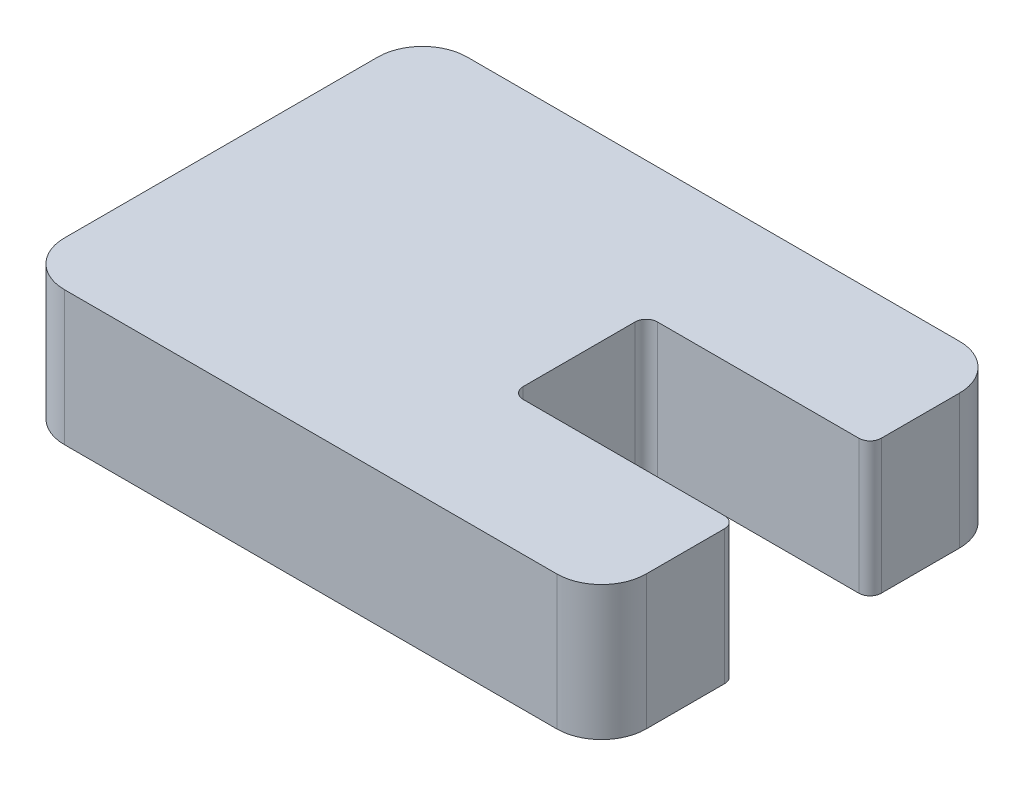
ISO-10303-21;
HEADER;
FILE_DESCRIPTION(('STEP AP214'),'2;1');
FILE_NAME('part.step','',(''),(''),'','','');
FILE_SCHEMA(('AUTOMOTIVE_DESIGN { 1 0 10303 214 1 1 1 1 }'));
ENDSEC;
DATA;
#1=APPLICATION_CONTEXT('core data for automotive mechanical design processes');
#2=APPLICATION_PROTOCOL_DEFINITION('international standard','automotive_design',2000,#1);
#3=PRODUCT_CONTEXT('',#1,'mechanical');
#4=PRODUCT('Part','Part','',(#3));
#5=PRODUCT_RELATED_PRODUCT_CATEGORY('part','',(#4));
#6=PRODUCT_DEFINITION_FORMATION('','',#4);
#7=PRODUCT_DEFINITION_CONTEXT('part definition',#1,'design');
#8=PRODUCT_DEFINITION('design','',#6,#7);
#9=PRODUCT_DEFINITION_SHAPE('','',#8);
#10=(LENGTH_UNIT() NAMED_UNIT(*) SI_UNIT(.MILLI.,.METRE.));
#11=(NAMED_UNIT(*) PLANE_ANGLE_UNIT() SI_UNIT($,.RADIAN.));
#12=(NAMED_UNIT(*) SI_UNIT($,.STERADIAN.) SOLID_ANGLE_UNIT());
#13=UNCERTAINTY_MEASURE_WITH_UNIT(LENGTH_MEASURE(1.E-05),#10,'distance_accuracy_value','');
#14=(GEOMETRIC_REPRESENTATION_CONTEXT(3) GLOBAL_UNCERTAINTY_ASSIGNED_CONTEXT((#13)) GLOBAL_UNIT_ASSIGNED_CONTEXT((#10,
#11,#12)) REPRESENTATION_CONTEXT('',''));
#15=CARTESIAN_POINT('',(0.,0.,0.));
#16=DIRECTION('',(0.,0.,1.));
#17=DIRECTION('',(1.,0.,0.));
#18=AXIS2_PLACEMENT_3D('',#15,#16,#17);
#19=CARTESIAN_POINT('',(12.,3.,3.5));
#20=DIRECTION('',(0.,-1.,0.));
#21=DIRECTION('',(0.,0.,-1.));
#22=AXIS2_PLACEMENT_3D('',#19,#20,#21);
#23=CYLINDRICAL_SURFACE('',#22,1.);
#24=CARTESIAN_POINT('',(12.,0.,3.5));
#25=DIRECTION('',(0.,1.,0.));
#26=DIRECTION('',(0.,0.,1.));
#27=AXIS2_PLACEMENT_3D('',#24,#25,#26);
#28=CIRCLE('',#27,1.);
#29=CARTESIAN_POINT('',(12.,0.,4.5));
#30=VERTEX_POINT('',#29);
#31=CARTESIAN_POINT('',(13.,0.,3.5));
#32=VERTEX_POINT('',#31);
#33=EDGE_CURVE('E170',#30,#32,#28,.T.);
#34=ORIENTED_EDGE('',*,*,#33,.T.);
#35=DIRECTION('',(0.,-1.,0.));
#36=VECTOR('',#35,1.);
#37=CARTESIAN_POINT('',(13.,3.,3.5));
#38=LINE('',#37,#36);
#39=CARTESIAN_POINT('',(13.,3.,3.5));
#40=VERTEX_POINT('',#39);
#41=EDGE_CURVE('E152',#40,#32,#38,.T.);
#42=ORIENTED_EDGE('',*,*,#41,.F.);
#43=CARTESIAN_POINT('',(12.,3.,3.5));
#44=DIRECTION('',(0.,1.,0.));
#45=DIRECTION('',(0.,0.,1.));
#46=AXIS2_PLACEMENT_3D('',#43,#44,#45);
#47=CIRCLE('',#46,1.);
#48=CARTESIAN_POINT('',(12.,3.,4.5));
#49=VERTEX_POINT('',#48);
#50=EDGE_CURVE('E158',#49,#40,#47,.T.);
#51=ORIENTED_EDGE('',*,*,#50,.F.);
#52=DIRECTION('',(0.,-1.,0.));
#53=VECTOR('',#52,1.);
#54=CARTESIAN_POINT('',(12.,3.,4.5));
#55=LINE('',#54,#53);
#56=EDGE_CURVE('E245',#49,#30,#55,.T.);
#57=ORIENTED_EDGE('',*,*,#56,.T.);
#58=EDGE_LOOP('',(#34,#42,#51,#57));
#59=FACE_BOUND('',#58,.T.);
#60=ADVANCED_FACE('F33',(#59),#23,.T.);
#61=CARTESIAN_POINT('',(13.,3.,3.5));
#62=DIRECTION('',(-1.,0.,0.));
#63=DIRECTION('',(0.,0.,1.));
#64=AXIS2_PLACEMENT_3D('',#61,#62,#63);
#65=PLANE('',#64);
#66=DIRECTION('',(0.,0.,-1.));
#67=VECTOR('',#66,1.);
#68=CARTESIAN_POINT('',(13.,0.,3.5));
#69=LINE('',#68,#67);
#70=CARTESIAN_POINT('',(13.,0.,1.75));
#71=VERTEX_POINT('',#70);
#72=EDGE_CURVE('E247',#32,#71,#69,.T.);
#73=ORIENTED_EDGE('',*,*,#72,.T.);
#74=DIRECTION('',(0.,-1.,0.));
#75=VECTOR('',#74,1.);
#76=CARTESIAN_POINT('',(13.,3.,1.75));
#77=LINE('',#76,#75);
#78=CARTESIAN_POINT('',(13.,3.,1.75));
#79=VERTEX_POINT('',#78);
#80=EDGE_CURVE('E155',#71,#79,#77,.F.);
#81=ORIENTED_EDGE('',*,*,#80,.T.);
#82=DIRECTION('',(0.,0.,-1.));
#83=VECTOR('',#82,1.);
#84=CARTESIAN_POINT('',(13.,3.,3.5));
#85=LINE('',#84,#83);
#86=EDGE_CURVE('E147',#40,#79,#85,.T.);
#87=ORIENTED_EDGE('',*,*,#86,.F.);
#88=ORIENTED_EDGE('',*,*,#41,.T.);
#89=EDGE_LOOP('',(#73,#81,#87,#88));
#90=FACE_BOUND('',#89,.T.);
#91=ADVANCED_FACE('F150',(#90),#65,.F.);
#92=CARTESIAN_POINT('',(13.,3.,1.5));
#93=DIRECTION('',(0.,0.,1.));
#94=DIRECTION('',(1.,0.,0.));
#95=AXIS2_PLACEMENT_3D('',#92,#93,#94);
#96=PLANE('',#95);
#97=DIRECTION('',(-1.,0.,0.));
#98=VECTOR('',#97,1.);
#99=CARTESIAN_POINT('',(13.,3.,1.5));
#100=LINE('',#99,#98);
#101=CARTESIAN_POINT('',(12.75,3.,1.5));
#102=VERTEX_POINT('',#101);
#103=CARTESIAN_POINT('',(8.24999999999999,3.,1.5));
#104=VERTEX_POINT('',#103);
#105=EDGE_CURVE('E157',#102,#104,#100,.T.);
#106=ORIENTED_EDGE('',*,*,#105,.F.);
#107=DIRECTION('',(0.,-1.,0.));
#108=VECTOR('',#107,1.);
#109=CARTESIAN_POINT('',(12.75,3.,1.5));
#110=LINE('',#109,#108);
#111=CARTESIAN_POINT('',(12.75,0.,1.5));
#112=VERTEX_POINT('',#111);
#113=EDGE_CURVE('E174',#102,#112,#110,.T.);
#114=ORIENTED_EDGE('',*,*,#113,.T.);
#115=DIRECTION('',(-1.,0.,0.));
#116=VECTOR('',#115,1.);
#117=CARTESIAN_POINT('',(13.,0.,1.5));
#118=LINE('',#117,#116);
#119=CARTESIAN_POINT('',(8.24999999999999,0.,1.5));
#120=VERTEX_POINT('',#119);
#121=EDGE_CURVE('E222',#112,#120,#118,.T.);
#122=ORIENTED_EDGE('',*,*,#121,.T.);
#123=DIRECTION('',(0.,-1.,0.));
#124=VECTOR('',#123,1.);
#125=CARTESIAN_POINT('',(8.24999999999999,3.,1.5));
#126=LINE('',#125,#124);
#127=EDGE_CURVE('E171',#120,#104,#126,.F.);
#128=ORIENTED_EDGE('',*,*,#127,.T.);
#129=EDGE_LOOP('',(#106,#114,#122,#128));
#130=FACE_BOUND('',#129,.T.);
#131=ADVANCED_FACE('F324',(#130),#96,.F.);
#132=CARTESIAN_POINT('',(7.99999999999999,3.,1.5));
#133=DIRECTION('',(-1.,0.,0.));
#134=DIRECTION('',(0.,0.,1.));
#135=AXIS2_PLACEMENT_3D('',#132,#133,#134);
#136=PLANE('',#135);
#137=DIRECTION('',(0.,0.,-1.));
#138=VECTOR('',#137,1.);
#139=CARTESIAN_POINT('',(7.99999999999999,3.,1.5));
#140=LINE('',#139,#138);
#141=CARTESIAN_POINT('',(7.99999999999999,3.,1.25));
#142=VERTEX_POINT('',#141);
#143=CARTESIAN_POINT('',(7.99999999999999,3.,-1.25));
#144=VERTEX_POINT('',#143);
#145=EDGE_CURVE('E226',#142,#144,#140,.T.);
#146=ORIENTED_EDGE('',*,*,#145,.F.);
#147=DIRECTION('',(0.,-1.,0.));
#148=VECTOR('',#147,1.);
#149=CARTESIAN_POINT('',(7.99999999999999,0.,1.25));
#150=LINE('',#149,#148);
#151=CARTESIAN_POINT('',(7.99999999999999,0.,1.25));
#152=VERTEX_POINT('',#151);
#153=EDGE_CURVE('E200',#142,#152,#150,.T.);
#154=ORIENTED_EDGE('',*,*,#153,.T.);
#155=DIRECTION('',(0.,0.,-1.));
#156=VECTOR('',#155,1.);
#157=CARTESIAN_POINT('',(7.99999999999999,0.,1.5));
#158=LINE('',#157,#156);
#159=CARTESIAN_POINT('',(7.99999999999999,0.,-1.25));
#160=VERTEX_POINT('',#159);
#161=EDGE_CURVE('E212',#152,#160,#158,.T.);
#162=ORIENTED_EDGE('',*,*,#161,.T.);
#163=DIRECTION('',(0.,-1.,0.));
#164=VECTOR('',#163,1.);
#165=CARTESIAN_POINT('',(7.99999999999999,3.,-1.25));
#166=LINE('',#165,#164);
#167=EDGE_CURVE('E198',#160,#144,#166,.F.);
#168=ORIENTED_EDGE('',*,*,#167,.T.);
#169=EDGE_LOOP('',(#146,#154,#162,#168));
#170=FACE_BOUND('',#169,.T.);
#171=ADVANCED_FACE('F219',(#170),#136,.F.);
#172=CARTESIAN_POINT('',(7.99999999999999,3.,-1.5));
#173=DIRECTION('',(0.,0.,-1.));
#174=DIRECTION('',(-1.,0.,0.));
#175=AXIS2_PLACEMENT_3D('',#172,#173,#174);
#176=PLANE('',#175);
#177=DIRECTION('',(1.,0.,0.));
#178=VECTOR('',#177,1.);
#179=CARTESIAN_POINT('',(7.99999999999999,0.,-1.5));
#180=LINE('',#179,#178);
#181=CARTESIAN_POINT('',(8.24999999999999,0.,-1.5));
#182=VERTEX_POINT('',#181);
#183=CARTESIAN_POINT('',(12.75,0.,-1.5));
#184=VERTEX_POINT('',#183);
#185=EDGE_CURVE('E213',#182,#184,#180,.T.);
#186=ORIENTED_EDGE('',*,*,#185,.T.);
#187=DIRECTION('',(0.,-1.,0.));
#188=VECTOR('',#187,1.);
#189=CARTESIAN_POINT('',(12.75,3.,-1.5));
#190=LINE('',#189,#188);
#191=CARTESIAN_POINT('',(12.75,3.,-1.5));
#192=VERTEX_POINT('',#191);
#193=EDGE_CURVE('E56',#184,#192,#190,.F.);
#194=ORIENTED_EDGE('',*,*,#193,.T.);
#195=DIRECTION('',(1.,0.,0.));
#196=VECTOR('',#195,1.);
#197=CARTESIAN_POINT('',(7.99999999999999,3.,-1.5));
#198=LINE('',#197,#196);
#199=CARTESIAN_POINT('',(8.24999999999999,3.,-1.5));
#200=VERTEX_POINT('',#199);
#201=EDGE_CURVE('E225',#200,#192,#198,.T.);
#202=ORIENTED_EDGE('',*,*,#201,.F.);
#203=DIRECTION('',(0.,-1.,0.));
#204=VECTOR('',#203,1.);
#205=CARTESIAN_POINT('',(8.24999999999999,0.,-1.5));
#206=LINE('',#205,#204);
#207=EDGE_CURVE('E194',#200,#182,#206,.T.);
#208=ORIENTED_EDGE('',*,*,#207,.T.);
#209=EDGE_LOOP('',(#186,#194,#202,#208));
#210=FACE_BOUND('',#209,.T.);
#211=ADVANCED_FACE('F227',(#210),#176,.F.);
#212=CARTESIAN_POINT('',(13.,3.,-1.5));
#213=DIRECTION('',(-1.,0.,0.));
#214=DIRECTION('',(0.,0.,1.));
#215=AXIS2_PLACEMENT_3D('',#212,#213,#214);
#216=PLANE('',#215);
#217=DIRECTION('',(0.,0.,-1.));
#218=VECTOR('',#217,1.);
#219=CARTESIAN_POINT('',(13.,3.,-1.5));
#220=LINE('',#219,#218);
#221=CARTESIAN_POINT('',(13.,3.,-1.75));
#222=VERTEX_POINT('',#221);
#223=CARTESIAN_POINT('',(13.,3.,-3.5));
#224=VERTEX_POINT('',#223);
#225=EDGE_CURVE('E228',#222,#224,#220,.T.);
#226=ORIENTED_EDGE('',*,*,#225,.F.);
#227=DIRECTION('',(0.,-1.,0.));
#228=VECTOR('',#227,1.);
#229=CARTESIAN_POINT('',(13.,3.,-1.75));
#230=LINE('',#229,#228);
#231=CARTESIAN_POINT('',(13.,0.,-1.75));
#232=VERTEX_POINT('',#231);
#233=EDGE_CURVE('E191',#222,#232,#230,.T.);
#234=ORIENTED_EDGE('',*,*,#233,.T.);
#235=DIRECTION('',(0.,0.,-1.));
#236=VECTOR('',#235,1.);
#237=CARTESIAN_POINT('',(13.,0.,-1.5));
#238=LINE('',#237,#236);
#239=CARTESIAN_POINT('',(13.,0.,-3.5));
#240=VERTEX_POINT('',#239);
#241=EDGE_CURVE('E252',#232,#240,#238,.T.);
#242=ORIENTED_EDGE('',*,*,#241,.T.);
#243=DIRECTION('',(0.,-1.,0.));
#244=VECTOR('',#243,1.);
#245=CARTESIAN_POINT('',(13.,3.,-3.5));
#246=LINE('',#245,#244);
#247=EDGE_CURVE('E172',#224,#240,#246,.T.);
#248=ORIENTED_EDGE('',*,*,#247,.F.);
#249=EDGE_LOOP('',(#226,#234,#242,#248));
#250=FACE_BOUND('',#249,.T.);
#251=ADVANCED_FACE('F304',(#250),#216,.F.);
#252=CARTESIAN_POINT('',(12.,3.,-3.5));
#253=DIRECTION('',(0.,-1.,0.));
#254=DIRECTION('',(0.,0.,-1.));
#255=AXIS2_PLACEMENT_3D('',#252,#253,#254);
#256=CYLINDRICAL_SURFACE('',#255,1.);
#257=CARTESIAN_POINT('',(12.,0.,-3.5));
#258=DIRECTION('',(0.,1.,0.));
#259=DIRECTION('',(0.,0.,1.));
#260=AXIS2_PLACEMENT_3D('',#257,#258,#259);
#261=CIRCLE('',#260,1.);
#262=CARTESIAN_POINT('',(12.,0.,-4.5));
#263=VERTEX_POINT('',#262);
#264=EDGE_CURVE('E254',#240,#263,#261,.T.);
#265=ORIENTED_EDGE('',*,*,#264,.T.);
#266=DIRECTION('',(0.,-1.,0.));
#267=VECTOR('',#266,1.);
#268=CARTESIAN_POINT('',(12.,3.,-4.5));
#269=LINE('',#268,#267);
#270=CARTESIAN_POINT('',(12.,3.,-4.5));
#271=VERTEX_POINT('',#270);
#272=EDGE_CURVE('E177',#271,#263,#269,.T.);
#273=ORIENTED_EDGE('',*,*,#272,.F.);
#274=CARTESIAN_POINT('',(12.,3.,-3.5));
#275=DIRECTION('',(0.,1.,0.));
#276=DIRECTION('',(0.,0.,1.));
#277=AXIS2_PLACEMENT_3D('',#274,#275,#276);
#278=CIRCLE('',#277,1.);
#279=EDGE_CURVE('E230',#224,#271,#278,.T.);
#280=ORIENTED_EDGE('',*,*,#279,.F.);
#281=ORIENTED_EDGE('',*,*,#247,.T.);
#282=EDGE_LOOP('',(#265,#273,#280,#281));
#283=FACE_BOUND('',#282,.T.);
#284=ADVANCED_FACE('F302',(#283),#256,.T.);
#285=CARTESIAN_POINT('',(12.,3.,-4.5));
#286=DIRECTION('',(0.,0.,1.));
#287=DIRECTION('',(1.,0.,0.));
#288=AXIS2_PLACEMENT_3D('',#285,#286,#287);
#289=PLANE('',#288);
#290=DIRECTION('',(-1.,0.,0.));
#291=VECTOR('',#290,1.);
#292=CARTESIAN_POINT('',(12.,0.,-4.5));
#293=LINE('',#292,#291);
#294=CARTESIAN_POINT('',(1.,0.,-4.5));
#295=VERTEX_POINT('',#294);
#296=EDGE_CURVE('E256',#263,#295,#293,.T.);
#297=ORIENTED_EDGE('',*,*,#296,.T.);
#298=DIRECTION('',(0.,-1.,0.));
#299=VECTOR('',#298,1.);
#300=CARTESIAN_POINT('',(1.,3.,-4.5));
#301=LINE('',#300,#299);
#302=CARTESIAN_POINT('',(1.,3.,-4.5));
#303=VERTEX_POINT('',#302);
#304=EDGE_CURVE('E275',#303,#295,#301,.T.);
#305=ORIENTED_EDGE('',*,*,#304,.F.);
#306=DIRECTION('',(-1.,0.,0.));
#307=VECTOR('',#306,1.);
#308=CARTESIAN_POINT('',(12.,3.,-4.5));
#309=LINE('',#308,#307);
#310=EDGE_CURVE('E236',#271,#303,#309,.T.);
#311=ORIENTED_EDGE('',*,*,#310,.F.);
#312=ORIENTED_EDGE('',*,*,#272,.T.);
#313=EDGE_LOOP('',(#297,#305,#311,#312));
#314=FACE_BOUND('',#313,.T.);
#315=ADVANCED_FACE('F282',(#314),#289,.F.);
#316=CARTESIAN_POINT('',(1.,3.,-3.5));
#317=DIRECTION('',(0.,-1.,0.));
#318=DIRECTION('',(0.,0.,-1.));
#319=AXIS2_PLACEMENT_3D('',#316,#317,#318);
#320=CYLINDRICAL_SURFACE('',#319,1.);
#321=CARTESIAN_POINT('',(1.,0.,-3.5));
#322=DIRECTION('',(0.,1.,0.));
#323=DIRECTION('',(0.,0.,-1.));
#324=AXIS2_PLACEMENT_3D('',#321,#322,#323);
#325=CIRCLE('',#324,1.);
#326=CARTESIAN_POINT('',(0.,0.,-3.5));
#327=VERTEX_POINT('',#326);
#328=EDGE_CURVE('E258',#295,#327,#325,.T.);
#329=ORIENTED_EDGE('',*,*,#328,.T.);
#330=DIRECTION('',(0.,-1.,0.));
#331=VECTOR('',#330,1.);
#332=CARTESIAN_POINT('',(0.,3.,-3.5));
#333=LINE('',#332,#331);
#334=CARTESIAN_POINT('',(0.,3.,-3.5));
#335=VERTEX_POINT('',#334);
#336=EDGE_CURVE('E272',#335,#327,#333,.T.);
#337=ORIENTED_EDGE('',*,*,#336,.F.);
#338=CARTESIAN_POINT('',(1.,3.,-3.5));
#339=DIRECTION('',(0.,1.,0.));
#340=DIRECTION('',(0.,0.,-1.));
#341=AXIS2_PLACEMENT_3D('',#338,#339,#340);
#342=CIRCLE('',#341,1.);
#343=EDGE_CURVE('E238',#303,#335,#342,.T.);
#344=ORIENTED_EDGE('',*,*,#343,.F.);
#345=ORIENTED_EDGE('',*,*,#304,.T.);
#346=EDGE_LOOP('',(#329,#337,#344,#345));
#347=FACE_BOUND('',#346,.T.);
#348=ADVANCED_FACE('F293',(#347),#320,.T.);
#349=CARTESIAN_POINT('',(0.,3.,-3.5));
#350=DIRECTION('',(1.,0.,0.));
#351=DIRECTION('',(0.,0.,-1.));
#352=AXIS2_PLACEMENT_3D('',#349,#350,#351);
#353=PLANE('',#352);
#354=DIRECTION('',(0.,0.,1.));
#355=VECTOR('',#354,1.);
#356=CARTESIAN_POINT('',(0.,0.,-3.5));
#357=LINE('',#356,#355);
#358=CARTESIAN_POINT('',(0.,0.,3.5));
#359=VERTEX_POINT('',#358);
#360=EDGE_CURVE('E260',#327,#359,#357,.T.);
#361=ORIENTED_EDGE('',*,*,#360,.T.);
#362=DIRECTION('',(0.,-1.,0.));
#363=VECTOR('',#362,1.);
#364=CARTESIAN_POINT('',(0.,3.,3.5));
#365=LINE('',#364,#363);
#366=CARTESIAN_POINT('',(0.,3.,3.5));
#367=VERTEX_POINT('',#366);
#368=EDGE_CURVE('E269',#367,#359,#365,.T.);
#369=ORIENTED_EDGE('',*,*,#368,.F.);
#370=DIRECTION('',(0.,0.,1.));
#371=VECTOR('',#370,1.);
#372=CARTESIAN_POINT('',(0.,3.,-3.5));
#373=LINE('',#372,#371);
#374=EDGE_CURVE('E240',#335,#367,#373,.T.);
#375=ORIENTED_EDGE('',*,*,#374,.F.);
#376=ORIENTED_EDGE('',*,*,#336,.T.);
#377=EDGE_LOOP('',(#361,#369,#375,#376));
#378=FACE_BOUND('',#377,.T.);
#379=ADVANCED_FACE('F297',(#378),#353,.F.);
#380=CARTESIAN_POINT('',(1.,3.,3.5));
#381=DIRECTION('',(0.,-1.,0.));
#382=DIRECTION('',(0.,0.,-1.));
#383=AXIS2_PLACEMENT_3D('',#380,#381,#382);
#384=CYLINDRICAL_SURFACE('',#383,1.);
#385=CARTESIAN_POINT('',(1.,0.,3.5));
#386=DIRECTION('',(0.,1.,0.));
#387=DIRECTION('',(0.,0.,1.));
#388=AXIS2_PLACEMENT_3D('',#385,#386,#387);
#389=CIRCLE('',#388,1.);
#390=CARTESIAN_POINT('',(1.,0.,4.5));
#391=VERTEX_POINT('',#390);
#392=EDGE_CURVE('E262',#359,#391,#389,.T.);
#393=ORIENTED_EDGE('',*,*,#392,.T.);
#394=DIRECTION('',(0.,-1.,0.));
#395=VECTOR('',#394,1.);
#396=CARTESIAN_POINT('',(1.,3.,4.5));
#397=LINE('',#396,#395);
#398=CARTESIAN_POINT('',(1.,3.,4.5));
#399=VERTEX_POINT('',#398);
#400=EDGE_CURVE('E266',#399,#391,#397,.T.);
#401=ORIENTED_EDGE('',*,*,#400,.F.);
#402=CARTESIAN_POINT('',(1.,3.,3.5));
#403=DIRECTION('',(0.,1.,0.));
#404=DIRECTION('',(0.,0.,1.));
#405=AXIS2_PLACEMENT_3D('',#402,#403,#404);
#406=CIRCLE('',#405,1.);
#407=EDGE_CURVE('E242',#367,#399,#406,.T.);
#408=ORIENTED_EDGE('',*,*,#407,.F.);
#409=ORIENTED_EDGE('',*,*,#368,.T.);
#410=EDGE_LOOP('',(#393,#401,#408,#409));
#411=FACE_BOUND('',#410,.T.);
#412=ADVANCED_FACE('F344',(#411),#384,.T.);
#413=CARTESIAN_POINT('',(1.,3.,4.5));
#414=DIRECTION('',(0.,0.,-1.));
#415=DIRECTION('',(-1.,0.,0.));
#416=AXIS2_PLACEMENT_3D('',#413,#414,#415);
#417=PLANE('',#416);
#418=DIRECTION('',(1.,0.,0.));
#419=VECTOR('',#418,1.);
#420=CARTESIAN_POINT('',(1.,0.,4.5));
#421=LINE('',#420,#419);
#422=EDGE_CURVE('E167',#391,#30,#421,.T.);
#423=ORIENTED_EDGE('',*,*,#422,.T.);
#424=ORIENTED_EDGE('',*,*,#56,.F.);
#425=DIRECTION('',(1.,0.,0.));
#426=VECTOR('',#425,1.);
#427=CARTESIAN_POINT('',(1.,3.,4.5));
#428=LINE('',#427,#426);
#429=EDGE_CURVE('E163',#399,#49,#428,.T.);
#430=ORIENTED_EDGE('',*,*,#429,.F.);
#431=ORIENTED_EDGE('',*,*,#400,.T.);
#432=EDGE_LOOP('',(#423,#424,#430,#431));
#433=FACE_BOUND('',#432,.T.);
#434=ADVANCED_FACE('F347',(#433),#417,.F.);
#435=CARTESIAN_POINT('',(12.,3.,3.5));
#436=DIRECTION('',(0.,1.,0.));
#437=DIRECTION('',(0.,0.,1.));
#438=AXIS2_PLACEMENT_3D('',#435,#436,#437);
#439=PLANE('',#438);
#440=ORIENTED_EDGE('',*,*,#86,.T.);
#441=CARTESIAN_POINT('',(12.75,3.,1.75));
#442=DIRECTION('',(0.,1.,0.));
#443=DIRECTION('',(0.,0.,1.));
#444=AXIS2_PLACEMENT_3D('',#441,#442,#443);
#445=CIRCLE('',#444,0.25);
#446=EDGE_CURVE('E189',#79,#102,#445,.T.);
#447=ORIENTED_EDGE('',*,*,#446,.T.);
#448=ORIENTED_EDGE('',*,*,#105,.T.);
#449=CARTESIAN_POINT('',(8.24999999999999,3.,1.25));
#450=DIRECTION('',(0.,1.,0.));
#451=DIRECTION('',(0.,0.,1.));
#452=AXIS2_PLACEMENT_3D('',#449,#450,#451);
#453=CIRCLE('',#452,0.25);
#454=EDGE_CURVE('E205',#104,#142,#453,.F.);
#455=ORIENTED_EDGE('',*,*,#454,.T.);
#456=ORIENTED_EDGE('',*,*,#145,.T.);
#457=CARTESIAN_POINT('',(8.24999999999999,3.,-1.25));
#458=DIRECTION('',(0.,1.,0.));
#459=DIRECTION('',(0.,0.,1.));
#460=AXIS2_PLACEMENT_3D('',#457,#458,#459);
#461=CIRCLE('',#460,0.25);
#462=EDGE_CURVE('E11',#144,#200,#461,.F.);
#463=ORIENTED_EDGE('',*,*,#462,.T.);
#464=ORIENTED_EDGE('',*,*,#201,.T.);
#465=CARTESIAN_POINT('',(12.75,3.,-1.75));
#466=DIRECTION('',(0.,1.,0.));
#467=DIRECTION('',(0.,0.,1.));
#468=AXIS2_PLACEMENT_3D('',#465,#466,#467);
#469=CIRCLE('',#468,0.25);
#470=EDGE_CURVE('E48',#192,#222,#469,.T.);
#471=ORIENTED_EDGE('',*,*,#470,.T.);
#472=ORIENTED_EDGE('',*,*,#225,.T.);
#473=ORIENTED_EDGE('',*,*,#279,.T.);
#474=ORIENTED_EDGE('',*,*,#310,.T.);
#475=ORIENTED_EDGE('',*,*,#343,.T.);
#476=ORIENTED_EDGE('',*,*,#374,.T.);
#477=ORIENTED_EDGE('',*,*,#407,.T.);
#478=ORIENTED_EDGE('',*,*,#429,.T.);
#479=ORIENTED_EDGE('',*,*,#50,.T.);
#480=EDGE_LOOP('',(#440,#447,#448,#455,#456,#463,#464,#471,#472,#473,#474,#475,#476,#477,#478,#479));
#481=FACE_BOUND('',#480,.T.);
#482=ADVANCED_FACE('F161',(#481),#439,.T.);
#483=CARTESIAN_POINT('',(12.,0.,3.5));
#484=DIRECTION('',(0.,1.,0.));
#485=DIRECTION('',(0.,0.,1.));
#486=AXIS2_PLACEMENT_3D('',#483,#484,#485);
#487=PLANE('',#486);
#488=ORIENTED_EDGE('',*,*,#121,.F.);
#489=CARTESIAN_POINT('',(12.75,0.,1.75));
#490=DIRECTION('',(0.,1.,0.));
#491=DIRECTION('',(0.,0.,1.));
#492=AXIS2_PLACEMENT_3D('',#489,#490,#491);
#493=CIRCLE('',#492,0.25);
#494=EDGE_CURVE('E185',#112,#71,#493,.F.);
#495=ORIENTED_EDGE('',*,*,#494,.T.);
#496=ORIENTED_EDGE('',*,*,#72,.F.);
#497=ORIENTED_EDGE('',*,*,#33,.F.);
#498=ORIENTED_EDGE('',*,*,#422,.F.);
#499=ORIENTED_EDGE('',*,*,#392,.F.);
#500=ORIENTED_EDGE('',*,*,#360,.F.);
#501=ORIENTED_EDGE('',*,*,#328,.F.);
#502=ORIENTED_EDGE('',*,*,#296,.F.);
#503=ORIENTED_EDGE('',*,*,#264,.F.);
#504=ORIENTED_EDGE('',*,*,#241,.F.);
#505=CARTESIAN_POINT('',(12.75,0.,-1.75));
#506=DIRECTION('',(0.,1.,0.));
#507=DIRECTION('',(0.,0.,1.));
#508=AXIS2_PLACEMENT_3D('',#505,#506,#507);
#509=CIRCLE('',#508,0.25);
#510=EDGE_CURVE('E183',#232,#184,#509,.F.);
#511=ORIENTED_EDGE('',*,*,#510,.T.);
#512=ORIENTED_EDGE('',*,*,#185,.F.);
#513=CARTESIAN_POINT('',(8.24999999999999,0.,-1.25));
#514=DIRECTION('',(0.,1.,0.));
#515=DIRECTION('',(0.,0.,1.));
#516=AXIS2_PLACEMENT_3D('',#513,#514,#515);
#517=CIRCLE('',#516,0.25);
#518=EDGE_CURVE('E41',#182,#160,#517,.T.);
#519=ORIENTED_EDGE('',*,*,#518,.T.);
#520=ORIENTED_EDGE('',*,*,#161,.F.);
#521=CARTESIAN_POINT('',(8.24999999999999,0.,1.25));
#522=DIRECTION('',(0.,1.,0.));
#523=DIRECTION('',(0.,0.,1.));
#524=AXIS2_PLACEMENT_3D('',#521,#522,#523);
#525=CIRCLE('',#524,0.25);
#526=EDGE_CURVE('E203',#152,#120,#525,.T.);
#527=ORIENTED_EDGE('',*,*,#526,.T.);
#528=EDGE_LOOP('',(#488,#495,#496,#497,#498,#499,#500,#501,#502,#503,#504,#511,#512,#519,#520,#527));
#529=FACE_BOUND('',#528,.T.);
#530=ADVANCED_FACE('F211',(#529),#487,.F.);
#531=CARTESIAN_POINT('',(12.75,3.,1.75));
#532=DIRECTION('',(0.,-1.,0.));
#533=DIRECTION('',(0.,0.,-1.));
#534=AXIS2_PLACEMENT_3D('',#531,#532,#533);
#535=CYLINDRICAL_SURFACE('',#534,0.25);
#536=ORIENTED_EDGE('',*,*,#446,.F.);
#537=ORIENTED_EDGE('',*,*,#80,.F.);
#538=ORIENTED_EDGE('',*,*,#494,.F.);
#539=ORIENTED_EDGE('',*,*,#113,.F.);
#540=EDGE_LOOP('',(#536,#537,#538,#539));
#541=FACE_BOUND('',#540,.T.);
#542=ADVANCED_FACE('F310',(#541),#535,.T.);
#543=CARTESIAN_POINT('',(12.75,3.,-1.75));
#544=DIRECTION('',(0.,-1.,0.));
#545=DIRECTION('',(0.,0.,-1.));
#546=AXIS2_PLACEMENT_3D('',#543,#544,#545);
#547=CYLINDRICAL_SURFACE('',#546,0.25);
#548=ORIENTED_EDGE('',*,*,#470,.F.);
#549=ORIENTED_EDGE('',*,*,#193,.F.);
#550=ORIENTED_EDGE('',*,*,#510,.F.);
#551=ORIENTED_EDGE('',*,*,#233,.F.);
#552=EDGE_LOOP('',(#548,#549,#550,#551));
#553=FACE_BOUND('',#552,.T.);
#554=ADVANCED_FACE('F307',(#553),#547,.T.);
#555=CARTESIAN_POINT('',(8.24999999999999,3.,1.25));
#556=DIRECTION('',(0.,1.,0.));
#557=DIRECTION('',(0.,0.,1.));
#558=AXIS2_PLACEMENT_3D('',#555,#556,#557);
#559=CYLINDRICAL_SURFACE('',#558,0.25);
#560=ORIENTED_EDGE('',*,*,#454,.F.);
#561=ORIENTED_EDGE('',*,*,#127,.F.);
#562=ORIENTED_EDGE('',*,*,#526,.F.);
#563=ORIENTED_EDGE('',*,*,#153,.F.);
#564=EDGE_LOOP('',(#560,#561,#562,#563));
#565=FACE_BOUND('',#564,.T.);
#566=ADVANCED_FACE('F309',(#565),#559,.F.);
#567=CARTESIAN_POINT('',(8.24999999999999,3.,-1.25));
#568=DIRECTION('',(0.,1.,0.));
#569=DIRECTION('',(0.,0.,1.));
#570=AXIS2_PLACEMENT_3D('',#567,#568,#569);
#571=CYLINDRICAL_SURFACE('',#570,0.25);
#572=ORIENTED_EDGE('',*,*,#462,.F.);
#573=ORIENTED_EDGE('',*,*,#167,.F.);
#574=ORIENTED_EDGE('',*,*,#518,.F.);
#575=ORIENTED_EDGE('',*,*,#207,.F.);
#576=EDGE_LOOP('',(#572,#573,#574,#575));
#577=FACE_BOUND('',#576,.T.);
#578=ADVANCED_FACE('F35',(#577),#571,.F.);
#579=CLOSED_SHELL('',(#60,#91,#131,#171,#211,#251,#284,#315,#348,#379,#412,#434,#482,#530,#542,
#554,#566,#578));
#580=MANIFOLD_SOLID_BREP('B2',#579);
#581=ADVANCED_BREP_SHAPE_REPRESENTATION('',(#18,#580),#14);
#582=SHAPE_DEFINITION_REPRESENTATION(#9,#581);
ENDSEC;
END-ISO-10303-21;
